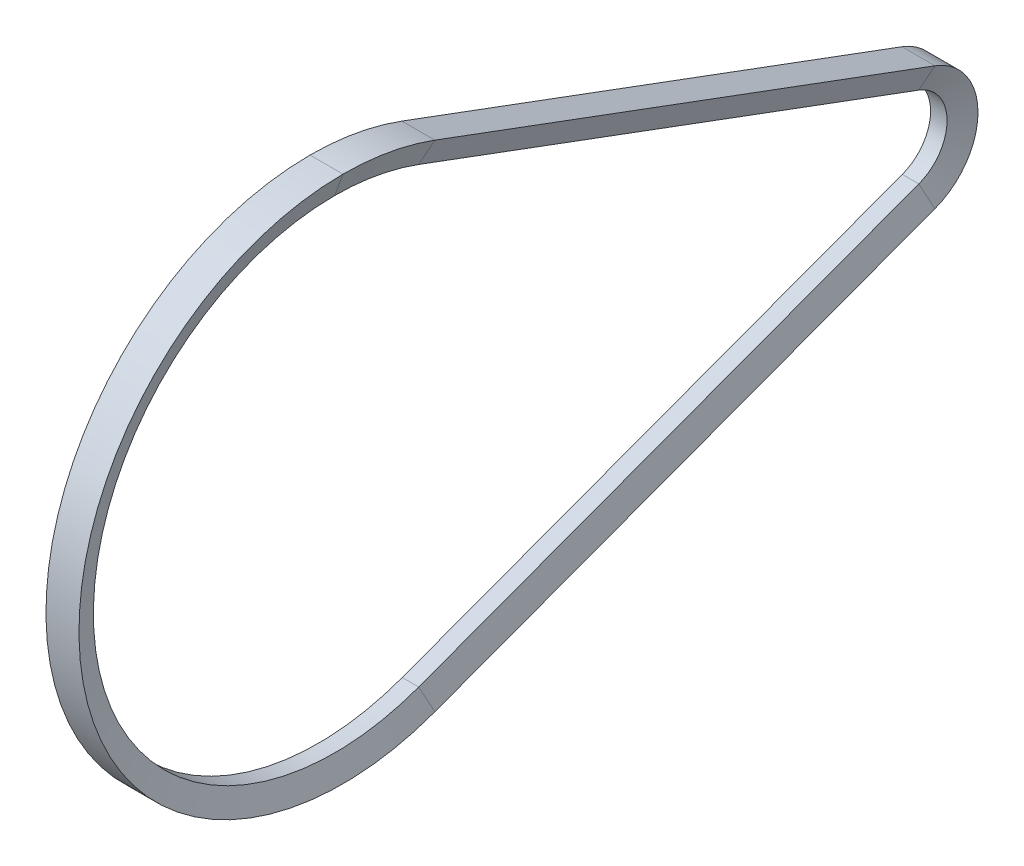
ISO-10303-21;
HEADER;
FILE_DESCRIPTION(('STEP AP214'),'2;1');
FILE_NAME('part.step','',(''),(''),'','','');
FILE_SCHEMA(('AUTOMOTIVE_DESIGN { 1 0 10303 214 1 1 1 1 }'));
ENDSEC;
DATA;
#1=APPLICATION_CONTEXT('core data for automotive mechanical design processes');
#2=APPLICATION_PROTOCOL_DEFINITION('international standard','automotive_design',2000,#1);
#3=PRODUCT_CONTEXT('',#1,'mechanical');
#4=PRODUCT('Part','Part','',(#3));
#5=PRODUCT_RELATED_PRODUCT_CATEGORY('part','',(#4));
#6=PRODUCT_DEFINITION_FORMATION('','',#4);
#7=PRODUCT_DEFINITION_CONTEXT('part definition',#1,'design');
#8=PRODUCT_DEFINITION('design','',#6,#7);
#9=PRODUCT_DEFINITION_SHAPE('','',#8);
#10=(LENGTH_UNIT() NAMED_UNIT(*) SI_UNIT(.MILLI.,.METRE.));
#11=(NAMED_UNIT(*) PLANE_ANGLE_UNIT() SI_UNIT($,.RADIAN.));
#12=(NAMED_UNIT(*) SI_UNIT($,.STERADIAN.) SOLID_ANGLE_UNIT());
#13=UNCERTAINTY_MEASURE_WITH_UNIT(LENGTH_MEASURE(1.E-05),#10,'distance_accuracy_value','');
#14=(GEOMETRIC_REPRESENTATION_CONTEXT(3) GLOBAL_UNCERTAINTY_ASSIGNED_CONTEXT((#13)) GLOBAL_UNIT_ASSIGNED_CONTEXT((#10,
#11,#12)) REPRESENTATION_CONTEXT('',''));
#15=CARTESIAN_POINT('',(0.,0.,0.));
#16=DIRECTION('',(0.,0.,1.));
#17=DIRECTION('',(1.,0.,0.));
#18=AXIS2_PLACEMENT_3D('',#15,#16,#17);
#19=CARTESIAN_POINT('',(-6.34999999999999,0.,0.));
#20=DIRECTION('',(-1.,0.,0.));
#21=DIRECTION('',(0.,0.,1.));
#22=AXIS2_PLACEMENT_3D('',#19,#20,#21);
#23=CONICAL_SURFACE('',#22,101.6,1.22173047639604);
#24=DIRECTION('',(0.342020143325663,0.880946982730876,0.32703919516911));
#25=VECTOR('',#24,1.);
#26=CARTESIAN_POINT('',(-6.34999999999994,-95.2483944915948,-35.3596287703015));
#27=LINE('',#26,#25);
#28=CARTESIAN_POINT('',(-6.34999999999994,-95.2483944915948,-35.3596287703015));
#29=VERTEX_POINT('',#28);
#30=CARTESIAN_POINT('',(-3.17208489206322,-87.0629855899733,-32.3209106728537));
#31=VERTEX_POINT('',#30);
#32=EDGE_CURVE('E164',#29,#31,#27,.T.);
#33=ORIENTED_EDGE('',*,*,#32,.F.);
#34=CARTESIAN_POINT('',(-6.34999999999999,0.,0.));
#35=DIRECTION('',(-1.,0.,0.));
#36=DIRECTION('',(0.,-0.937484197751917,-0.348027842227378));
#37=AXIS2_PLACEMENT_3D('',#34,#35,#36);
#38=CIRCLE('',#37,101.6);
#39=CARTESIAN_POINT('',(-6.34999999999994,101.6,0.));
#40=VERTEX_POINT('',#39);
#41=EDGE_CURVE('E163',#29,#40,#38,.T.);
#42=ORIENTED_EDGE('',*,*,#41,.T.);
#43=DIRECTION('',(0.342020143325663,-0.939692620785911,0.));
#44=VECTOR('',#43,1.);
#45=CARTESIAN_POINT('',(-6.34999999999994,101.6,0.));
#46=LINE('',#45,#44);
#47=CARTESIAN_POINT('',(-3.17208489206322,92.8687499999999,0.));
#48=VERTEX_POINT('',#47);
#49=EDGE_CURVE('E138',#40,#48,#46,.T.);
#50=ORIENTED_EDGE('',*,*,#49,.T.);
#51=CARTESIAN_POINT('',(-3.17208489206328,0.,0.));
#52=DIRECTION('',(-1.,0.,0.));
#53=DIRECTION('',(0.,-0.937484197751917,-0.348027842227378));
#54=AXIS2_PLACEMENT_3D('',#51,#52,#53);
#55=CIRCLE('',#54,92.86875);
#56=EDGE_CURVE('E168',#31,#48,#55,.T.);
#57=ORIENTED_EDGE('',*,*,#56,.F.);
#58=EDGE_LOOP('',(#33,#42,#50,#57));
#59=FACE_BOUND('',#58,.T.);
#60=ADVANCED_FACE('F30',(#59),#23,.F.);
#61=CARTESIAN_POINT('',(-6.34999999999999,0.,0.));
#62=DIRECTION('',(-1.,0.,0.));
#63=DIRECTION('',(0.,0.,1.));
#64=AXIS2_PLACEMENT_3D('',#61,#62,#63);
#65=CONICAL_SURFACE('',#64,101.6,1.22173047639604);
#66=CARTESIAN_POINT('',(-3.17208489206328,0.,0.));
#67=DIRECTION('',(-1.,0.,0.));
#68=DIRECTION('',(0.,1.,0.));
#69=AXIS2_PLACEMENT_3D('',#66,#67,#68);
#70=CIRCLE('',#69,92.86875);
#71=CARTESIAN_POINT('',(-3.17208489206325,87.0629855899733,-32.3209106728539));
#72=VERTEX_POINT('',#71);
#73=EDGE_CURVE('E144',#48,#72,#70,.T.);
#74=ORIENTED_EDGE('',*,*,#73,.F.);
#75=ORIENTED_EDGE('',*,*,#49,.F.);
#76=CARTESIAN_POINT('',(-6.34999999999999,0.,0.));
#77=DIRECTION('',(-1.,0.,0.));
#78=DIRECTION('',(0.,1.,0.));
#79=AXIS2_PLACEMENT_3D('',#76,#77,#78);
#80=CIRCLE('',#79,101.6);
#81=CARTESIAN_POINT('',(-6.34999999999997,95.2483944915947,-35.359628770302));
#82=VERTEX_POINT('',#81);
#83=EDGE_CURVE('E142',#40,#82,#80,.T.);
#84=ORIENTED_EDGE('',*,*,#83,.T.);
#85=DIRECTION('',(0.342020143325663,-0.880946982730875,0.327039195169111));
#86=VECTOR('',#85,1.);
#87=CARTESIAN_POINT('',(-6.34999999999997,95.2483944915947,-35.359628770302));
#88=LINE('',#87,#86);
#89=EDGE_CURVE('E160',#82,#72,#88,.T.);
#90=ORIENTED_EDGE('',*,*,#89,.T.);
#91=EDGE_LOOP('',(#74,#75,#84,#90));
#92=FACE_BOUND('',#91,.T.);
#93=ADVANCED_FACE('F140',(#92),#65,.F.);
#94=CARTESIAN_POINT('',(0.,0.,0.));
#95=DIRECTION('',(-1.,0.,0.));
#96=DIRECTION('',(0.,0.,1.));
#97=AXIS2_PLACEMENT_3D('',#94,#95,#96);
#98=CYLINDRICAL_SURFACE('',#97,92.86875);
#99=CARTESIAN_POINT('',(3.17208489206328,0.,0.));
#100=DIRECTION('',(-1.,0.,0.));
#101=DIRECTION('',(0.,1.,0.));
#102=AXIS2_PLACEMENT_3D('',#99,#100,#101);
#103=CIRCLE('',#102,92.86875);
#104=CARTESIAN_POINT('',(3.17208489206333,92.8687499999999,0.));
#105=VERTEX_POINT('',#104);
#106=CARTESIAN_POINT('',(3.17208489206333,87.0629855899733,-32.3209106728539));
#107=VERTEX_POINT('',#106);
#108=EDGE_CURVE('E209',#105,#107,#103,.T.);
#109=ORIENTED_EDGE('',*,*,#108,.F.);
#110=DIRECTION('',(1.,0.,0.));
#111=VECTOR('',#110,1.);
#112=CARTESIAN_POINT('',(3.17208489206333,92.8687499999999,0.));
#113=LINE('',#112,#111);
#114=EDGE_CURVE('E149',#48,#105,#113,.T.);
#115=ORIENTED_EDGE('',*,*,#114,.F.);
#116=ORIENTED_EDGE('',*,*,#73,.T.);
#117=DIRECTION('',(1.,0.,0.));
#118=VECTOR('',#117,1.);
#119=CARTESIAN_POINT('',(3.17208489206333,87.0629855899733,-32.3209106728539));
#120=LINE('',#119,#118);
#121=EDGE_CURVE('E230',#72,#107,#120,.T.);
#122=ORIENTED_EDGE('',*,*,#121,.T.);
#123=EDGE_LOOP('',(#109,#115,#116,#122));
#124=FACE_BOUND('',#123,.T.);
#125=ADVANCED_FACE('F256',(#124),#98,.F.);
#126=CARTESIAN_POINT('',(3.17208489206328,0.,0.));
#127=DIRECTION('',(1.,0.,0.));
#128=DIRECTION('',(0.,0.,-1.));
#129=AXIS2_PLACEMENT_3D('',#126,#127,#128);
#130=CONICAL_SURFACE('',#129,92.86875,1.22173047639604);
#131=CARTESIAN_POINT('',(6.34999999999999,0.,0.));
#132=DIRECTION('',(-1.,0.,0.));
#133=DIRECTION('',(0.,1.,0.));
#134=AXIS2_PLACEMENT_3D('',#131,#132,#133);
#135=CIRCLE('',#134,101.6);
#136=CARTESIAN_POINT('',(6.35000000000005,101.6,0.));
#137=VERTEX_POINT('',#136);
#138=CARTESIAN_POINT('',(6.35000000000005,95.2483944915947,-35.359628770302));
#139=VERTEX_POINT('',#138);
#140=EDGE_CURVE('E179',#137,#139,#135,.T.);
#141=ORIENTED_EDGE('',*,*,#140,.F.);
#142=DIRECTION('',(0.342020143325663,0.939692620785911,0.));
#143=VECTOR('',#142,1.);
#144=CARTESIAN_POINT('',(6.35000000000005,101.6,0.));
#145=LINE('',#144,#143);
#146=EDGE_CURVE('E171',#105,#137,#145,.T.);
#147=ORIENTED_EDGE('',*,*,#146,.F.);
#148=ORIENTED_EDGE('',*,*,#108,.T.);
#149=DIRECTION('',(0.342020143325663,0.880946982730875,-0.327039195169111));
#150=VECTOR('',#149,1.);
#151=CARTESIAN_POINT('',(6.35000000000005,95.2483944915947,-35.359628770302));
#152=LINE('',#151,#150);
#153=EDGE_CURVE('E206',#107,#139,#152,.T.);
#154=ORIENTED_EDGE('',*,*,#153,.T.);
#155=EDGE_LOOP('',(#141,#147,#148,#154));
#156=FACE_BOUND('',#155,.T.);
#157=ADVANCED_FACE('F253',(#156),#130,.F.);
#158=CARTESIAN_POINT('',(0.,0.,0.));
#159=DIRECTION('',(-1.,0.,0.));
#160=DIRECTION('',(0.,0.,1.));
#161=AXIS2_PLACEMENT_3D('',#158,#159,#160);
#162=CYLINDRICAL_SURFACE('',#161,101.6);
#163=DIRECTION('',(-1.,0.,0.));
#164=VECTOR('',#163,1.);
#165=CARTESIAN_POINT('',(-6.34999999999997,95.2483944915947,-35.359628770302));
#166=LINE('',#165,#164);
#167=EDGE_CURVE('E158',#139,#82,#166,.T.);
#168=ORIENTED_EDGE('',*,*,#167,.T.);
#169=ORIENTED_EDGE('',*,*,#83,.F.);
#170=DIRECTION('',(-1.,0.,0.));
#171=VECTOR('',#170,1.);
#172=CARTESIAN_POINT('',(-6.34999999999994,101.6,0.));
#173=LINE('',#172,#171);
#174=EDGE_CURVE('E156',#137,#40,#173,.T.);
#175=ORIENTED_EDGE('',*,*,#174,.F.);
#176=ORIENTED_EDGE('',*,*,#140,.T.);
#177=EDGE_LOOP('',(#168,#169,#175,#176));
#178=FACE_BOUND('',#177,.T.);
#179=ADVANCED_FACE('F154',(#178),#162,.T.);
#180=CARTESIAN_POINT('',(-6.34999999999997,95.2483944915947,-35.359628770302));
#181=DIRECTION('',(0.93969262078591,0.320638479680655,-0.119032532479929));
#182=DIRECTION('',(-0.322934428965581,0.94642134094106,0.));
#183=AXIS2_PLACEMENT_3D('',#180,#181,#182);
#184=PLANE('',#183);
#185=DIRECTION('',(0.,-0.348027842227378,-0.937484197751917));
#186=VECTOR('',#185,1.);
#187=CARTESIAN_POINT('',(-3.17208489206325,87.0629855899733,-32.3209106728539));
#188=LINE('',#187,#186);
#189=CARTESIAN_POINT('',(-3.17208489206328,15.6266897212771,-224.749189095128));
#190=VERTEX_POINT('',#189);
#191=EDGE_CURVE('E123',#72,#190,#188,.T.);
#192=ORIENTED_EDGE('',*,*,#191,.F.);
#193=ORIENTED_EDGE('',*,*,#89,.F.);
#194=DIRECTION('',(0.,-0.348027842227378,-0.937484197751917));
#195=VECTOR('',#194,1.);
#196=CARTESIAN_POINT('',(-6.34999999999997,95.2483944915947,-35.359628770302));
#197=LINE('',#196,#195);
#198=CARTESIAN_POINT('',(-6.34999999999997,23.8120986228986,-227.787907192575));
#199=VERTEX_POINT('',#198);
#200=EDGE_CURVE('E178',#82,#199,#197,.T.);
#201=ORIENTED_EDGE('',*,*,#200,.T.);
#202=DIRECTION('',(0.342020143325663,-0.880946982730875,0.327039195169111));
#203=VECTOR('',#202,1.);
#204=CARTESIAN_POINT('',(-6.34999999999997,23.8120986228986,-227.787907192575));
#205=LINE('',#204,#203);
#206=EDGE_CURVE('E250',#199,#190,#205,.T.);
#207=ORIENTED_EDGE('',*,*,#206,.T.);
#208=EDGE_LOOP('',(#192,#193,#201,#207));
#209=FACE_BOUND('',#208,.T.);
#210=ADVANCED_FACE('F260',(#209),#184,.F.);
#211=CARTESIAN_POINT('',(3.17208489206333,87.0629855899733,-32.3209106728539));
#212=DIRECTION('',(0.,0.937484197751917,-0.348027842227378));
#213=DIRECTION('',(0.,0.348027842227378,0.937484197751917));
#214=AXIS2_PLACEMENT_3D('',#211,#212,#213);
#215=PLANE('',#214);
#216=DIRECTION('',(0.,-0.348027842227378,-0.937484197751917));
#217=VECTOR('',#216,1.);
#218=CARTESIAN_POINT('',(3.17208489206333,87.0629855899733,-32.3209106728539));
#219=LINE('',#218,#217);
#220=CARTESIAN_POINT('',(3.1720848920633,15.6266897212771,-224.749189095128));
#221=VERTEX_POINT('',#220);
#222=EDGE_CURVE('E117',#107,#221,#219,.T.);
#223=ORIENTED_EDGE('',*,*,#222,.F.);
#224=ORIENTED_EDGE('',*,*,#121,.F.);
#225=ORIENTED_EDGE('',*,*,#191,.T.);
#226=DIRECTION('',(1.,0.,0.));
#227=VECTOR('',#226,1.);
#228=CARTESIAN_POINT('',(3.1720848920633,15.6266897212772,-224.749189095128));
#229=LINE('',#228,#227);
#230=EDGE_CURVE('E234',#190,#221,#229,.T.);
#231=ORIENTED_EDGE('',*,*,#230,.T.);
#232=EDGE_LOOP('',(#223,#224,#225,#231));
#233=FACE_BOUND('',#232,.T.);
#234=ADVANCED_FACE('F251',(#233),#215,.F.);
#235=CARTESIAN_POINT('',(6.35000000000005,95.2483944915947,-35.359628770302));
#236=DIRECTION('',(-0.939692620785911,0.320638479680655,-0.119032532479929));
#237=DIRECTION('',(-0.322934428965581,-0.94642134094106,0.));
#238=AXIS2_PLACEMENT_3D('',#235,#236,#237);
#239=PLANE('',#238);
#240=DIRECTION('',(0.,-0.348027842227378,-0.937484197751917));
#241=VECTOR('',#240,1.);
#242=CARTESIAN_POINT('',(6.35000000000005,95.2483944915947,-35.359628770302));
#243=LINE('',#242,#241);
#244=CARTESIAN_POINT('',(6.35000000000002,23.8120986228986,-227.787907192575));
#245=VERTEX_POINT('',#244);
#246=EDGE_CURVE('E183',#139,#245,#243,.T.);
#247=ORIENTED_EDGE('',*,*,#246,.F.);
#248=ORIENTED_EDGE('',*,*,#153,.F.);
#249=ORIENTED_EDGE('',*,*,#222,.T.);
#250=DIRECTION('',(0.342020143325663,0.880946982730875,-0.327039195169111));
#251=VECTOR('',#250,1.);
#252=CARTESIAN_POINT('',(6.35000000000002,23.8120986228986,-227.787907192575));
#253=LINE('',#252,#251);
#254=EDGE_CURVE('E211',#221,#245,#253,.T.);
#255=ORIENTED_EDGE('',*,*,#254,.T.);
#256=EDGE_LOOP('',(#247,#248,#249,#255));
#257=FACE_BOUND('',#256,.T.);
#258=ADVANCED_FACE('F215',(#257),#239,.F.);
#259=CARTESIAN_POINT('',(-6.34999999999997,95.2483944915947,-35.359628770302));
#260=DIRECTION('',(0.,-0.937484197751917,0.348027842227378));
#261=DIRECTION('',(0.,-0.348027842227378,-0.937484197751917));
#262=AXIS2_PLACEMENT_3D('',#259,#260,#261);
#263=PLANE('',#262);
#264=DIRECTION('',(-1.,0.,0.));
#265=VECTOR('',#264,1.);
#266=CARTESIAN_POINT('',(-6.34999999999997,23.8120986228986,-227.787907192575));
#267=LINE('',#266,#265);
#268=EDGE_CURVE('E180',#245,#199,#267,.T.);
#269=ORIENTED_EDGE('',*,*,#268,.T.);
#270=ORIENTED_EDGE('',*,*,#200,.F.);
#271=ORIENTED_EDGE('',*,*,#167,.F.);
#272=ORIENTED_EDGE('',*,*,#246,.T.);
#273=EDGE_LOOP('',(#269,#270,#271,#272));
#274=FACE_BOUND('',#273,.T.);
#275=ADVANCED_FACE('F214',(#274),#263,.F.);
#276=CARTESIAN_POINT('',(-6.34999999999999,-1.11022302462516E-13,-218.948));
#277=DIRECTION('',(-1.,0.,0.));
#278=DIRECTION('',(0.,0.,1.));
#279=AXIS2_PLACEMENT_3D('',#276,#277,#278);
#280=CONICAL_SURFACE('',#279,25.3999999999999,1.22173047639604);
#281=CARTESIAN_POINT('',(-3.17208489206328,-1.11022302462516E-13,-218.948));
#282=DIRECTION('',(-1.,0.,0.));
#283=DIRECTION('',(0.,0.937484197751916,-0.348027842227381));
#284=AXIS2_PLACEMENT_3D('',#281,#282,#283);
#285=CIRCLE('',#284,16.66875);
#286=CARTESIAN_POINT('',(-3.17208489206328,-15.6266897212772,-224.749189095128));
#287=VERTEX_POINT('',#286);
#288=EDGE_CURVE('E100',#190,#287,#285,.T.);
#289=ORIENTED_EDGE('',*,*,#288,.F.);
#290=ORIENTED_EDGE('',*,*,#206,.F.);
#291=CARTESIAN_POINT('',(-6.34999999999999,-1.11022302462516E-13,-218.948));
#292=DIRECTION('',(-1.,0.,0.));
#293=DIRECTION('',(0.,0.937484197751916,-0.34802784222738));
#294=AXIS2_PLACEMENT_3D('',#291,#292,#293);
#295=CIRCLE('',#294,25.3999999999999);
#296=CARTESIAN_POINT('',(-6.34999999999999,-23.8120986228987,-227.787907192575));
#297=VERTEX_POINT('',#296);
#298=EDGE_CURVE('E182',#199,#297,#295,.T.);
#299=ORIENTED_EDGE('',*,*,#298,.T.);
#300=DIRECTION('',(0.342020143325663,0.880946982730876,0.327039195169111));
#301=VECTOR('',#300,1.);
#302=CARTESIAN_POINT('',(-6.34999999999999,-23.8120986228987,-227.787907192575));
#303=LINE('',#302,#301);
#304=EDGE_CURVE('E221',#297,#287,#303,.T.);
#305=ORIENTED_EDGE('',*,*,#304,.T.);
#306=EDGE_LOOP('',(#289,#290,#299,#305));
#307=FACE_BOUND('',#306,.T.);
#308=ADVANCED_FACE('F249',(#307),#280,.F.);
#309=CARTESIAN_POINT('',(0.,-1.11022302462516E-13,-218.948));
#310=DIRECTION('',(-1.,0.,0.));
#311=DIRECTION('',(0.,0.,1.));
#312=AXIS2_PLACEMENT_3D('',#309,#310,#311);
#313=CYLINDRICAL_SURFACE('',#312,16.66875);
#314=CARTESIAN_POINT('',(3.1720848920633,-1.11022302462516E-13,-218.948));
#315=DIRECTION('',(-1.,0.,0.));
#316=DIRECTION('',(0.,0.937484197751916,-0.348027842227381));
#317=AXIS2_PLACEMENT_3D('',#314,#315,#316);
#318=CIRCLE('',#317,16.66875);
#319=CARTESIAN_POINT('',(3.17208489206328,-15.6266897212772,-224.749189095128));
#320=VERTEX_POINT('',#319);
#321=EDGE_CURVE('E93',#221,#320,#318,.T.);
#322=ORIENTED_EDGE('',*,*,#321,.F.);
#323=ORIENTED_EDGE('',*,*,#230,.F.);
#324=ORIENTED_EDGE('',*,*,#288,.T.);
#325=DIRECTION('',(1.,0.,0.));
#326=VECTOR('',#325,1.);
#327=CARTESIAN_POINT('',(3.17208489206328,-15.6266897212772,-224.749189095128));
#328=LINE('',#327,#326);
#329=EDGE_CURVE('E237',#287,#320,#328,.T.);
#330=ORIENTED_EDGE('',*,*,#329,.T.);
#331=EDGE_LOOP('',(#322,#323,#324,#330));
#332=FACE_BOUND('',#331,.T.);
#333=ADVANCED_FACE('F239',(#332),#313,.F.);
#334=CARTESIAN_POINT('',(3.1720848920633,-1.11022302462516E-13,-218.948));
#335=DIRECTION('',(1.,0.,0.));
#336=DIRECTION('',(0.,0.,-1.));
#337=AXIS2_PLACEMENT_3D('',#334,#335,#336);
#338=CONICAL_SURFACE('',#337,16.66875,1.22173047639604);
#339=CARTESIAN_POINT('',(6.35000000000002,-1.11022302462516E-13,-218.948));
#340=DIRECTION('',(-1.,0.,0.));
#341=DIRECTION('',(0.,0.937484197751916,-0.34802784222738));
#342=AXIS2_PLACEMENT_3D('',#339,#340,#341);
#343=CIRCLE('',#342,25.3999999999999);
#344=CARTESIAN_POINT('',(6.34999999999999,-23.8120986228987,-227.787907192575));
#345=VERTEX_POINT('',#344);
#346=EDGE_CURVE('E84',#245,#345,#343,.T.);
#347=ORIENTED_EDGE('',*,*,#346,.F.);
#348=ORIENTED_EDGE('',*,*,#254,.F.);
#349=ORIENTED_EDGE('',*,*,#321,.T.);
#350=DIRECTION('',(0.342020143325663,-0.880946982730876,-0.327039195169111));
#351=VECTOR('',#350,1.);
#352=CARTESIAN_POINT('',(6.34999999999999,-23.8120986228987,-227.787907192575));
#353=LINE('',#352,#351);
#354=EDGE_CURVE('E190',#320,#345,#353,.T.);
#355=ORIENTED_EDGE('',*,*,#354,.T.);
#356=EDGE_LOOP('',(#347,#348,#349,#355));
#357=FACE_BOUND('',#356,.T.);
#358=ADVANCED_FACE('F216',(#357),#338,.F.);
#359=CARTESIAN_POINT('',(0.,-1.11022302462516E-13,-218.948));
#360=DIRECTION('',(-1.,0.,0.));
#361=DIRECTION('',(0.,0.,1.));
#362=AXIS2_PLACEMENT_3D('',#359,#360,#361);
#363=CYLINDRICAL_SURFACE('',#362,25.3999999999999);
#364=DIRECTION('',(-1.,0.,0.));
#365=VECTOR('',#364,1.);
#366=CARTESIAN_POINT('',(-6.34999999999999,-23.8120986228987,-227.787907192575));
#367=LINE('',#366,#365);
#368=EDGE_CURVE('E184',#345,#297,#367,.T.);
#369=ORIENTED_EDGE('',*,*,#368,.T.);
#370=ORIENTED_EDGE('',*,*,#298,.F.);
#371=ORIENTED_EDGE('',*,*,#268,.F.);
#372=ORIENTED_EDGE('',*,*,#346,.T.);
#373=EDGE_LOOP('',(#369,#370,#371,#372));
#374=FACE_BOUND('',#373,.T.);
#375=ADVANCED_FACE('F217',(#374),#363,.T.);
#376=CARTESIAN_POINT('',(-6.34999999999999,-23.8120986228987,-227.787907192575));
#377=DIRECTION('',(0.93969262078591,-0.320638479680655,-0.119032532479929));
#378=DIRECTION('',(0.322934428965581,0.94642134094106,0.));
#379=AXIS2_PLACEMENT_3D('',#376,#377,#378);
#380=PLANE('',#379);
#381=DIRECTION('',(0.,-0.348027842227378,0.937484197751917));
#382=VECTOR('',#381,1.);
#383=CARTESIAN_POINT('',(-3.17208489206328,-15.6266897212772,-224.749189095128));
#384=LINE('',#383,#382);
#385=EDGE_CURVE('E188',#287,#31,#384,.T.);
#386=ORIENTED_EDGE('',*,*,#385,.F.);
#387=ORIENTED_EDGE('',*,*,#304,.F.);
#388=DIRECTION('',(0.,-0.348027842227378,0.937484197751917));
#389=VECTOR('',#388,1.);
#390=CARTESIAN_POINT('',(-6.34999999999999,-23.8120986228987,-227.787907192575));
#391=LINE('',#390,#389);
#392=EDGE_CURVE('E185',#297,#29,#391,.T.);
#393=ORIENTED_EDGE('',*,*,#392,.T.);
#394=ORIENTED_EDGE('',*,*,#32,.T.);
#395=EDGE_LOOP('',(#386,#387,#393,#394));
#396=FACE_BOUND('',#395,.T.);
#397=ADVANCED_FACE('F248',(#396),#380,.F.);
#398=CARTESIAN_POINT('',(3.17208489206328,-15.6266897212772,-224.749189095128));
#399=DIRECTION('',(0.,-0.937484197751917,-0.348027842227378));
#400=DIRECTION('',(0.,0.348027842227378,-0.937484197751917));
#401=AXIS2_PLACEMENT_3D('',#398,#399,#400);
#402=PLANE('',#401);
#403=DIRECTION('',(0.,-0.348027842227378,0.937484197751917));
#404=VECTOR('',#403,1.);
#405=CARTESIAN_POINT('',(3.17208489206328,-15.6266897212772,-224.749189095128));
#406=LINE('',#405,#404);
#407=CARTESIAN_POINT('',(3.17208489206333,-87.0629855899733,-32.3209106728537));
#408=VERTEX_POINT('',#407);
#409=EDGE_CURVE('E55',#320,#408,#406,.T.);
#410=ORIENTED_EDGE('',*,*,#409,.F.);
#411=ORIENTED_EDGE('',*,*,#329,.F.);
#412=ORIENTED_EDGE('',*,*,#385,.T.);
#413=DIRECTION('',(1.,0.,0.));
#414=VECTOR('',#413,1.);
#415=CARTESIAN_POINT('',(3.17208489206333,-87.0629855899733,-32.3209106728537));
#416=LINE('',#415,#414);
#417=EDGE_CURVE('E196',#31,#408,#416,.T.);
#418=ORIENTED_EDGE('',*,*,#417,.T.);
#419=EDGE_LOOP('',(#410,#411,#412,#418));
#420=FACE_BOUND('',#419,.T.);
#421=ADVANCED_FACE('F241',(#420),#402,.F.);
#422=CARTESIAN_POINT('',(6.34999999999999,-23.8120986228987,-227.787907192575));
#423=DIRECTION('',(-0.939692620785911,-0.320638479680655,-0.119032532479929));
#424=DIRECTION('',(0.322934428965581,-0.94642134094106,0.));
#425=AXIS2_PLACEMENT_3D('',#422,#423,#424);
#426=PLANE('',#425);
#427=DIRECTION('',(0.,-0.348027842227378,0.937484197751917));
#428=VECTOR('',#427,1.);
#429=CARTESIAN_POINT('',(6.34999999999999,-23.8120986228987,-227.787907192575));
#430=LINE('',#429,#428);
#431=CARTESIAN_POINT('',(6.35000000000005,-95.2483944915948,-35.3596287703015));
#432=VERTEX_POINT('',#431);
#433=EDGE_CURVE('E47',#345,#432,#430,.T.);
#434=ORIENTED_EDGE('',*,*,#433,.F.);
#435=ORIENTED_EDGE('',*,*,#354,.F.);
#436=ORIENTED_EDGE('',*,*,#409,.T.);
#437=DIRECTION('',(0.342020143325663,-0.880946982730876,-0.32703919516911));
#438=VECTOR('',#437,1.);
#439=CARTESIAN_POINT('',(6.35000000000005,-95.2483944915948,-35.3596287703015));
#440=LINE('',#439,#438);
#441=EDGE_CURVE('E195',#408,#432,#440,.T.);
#442=ORIENTED_EDGE('',*,*,#441,.T.);
#443=EDGE_LOOP('',(#434,#435,#436,#442));
#444=FACE_BOUND('',#443,.T.);
#445=ADVANCED_FACE('F244',(#444),#426,.F.);
#446=CARTESIAN_POINT('',(-6.34999999999999,-23.8120986228987,-227.787907192575));
#447=DIRECTION('',(0.,0.937484197751917,0.348027842227378));
#448=DIRECTION('',(0.,-0.348027842227378,0.937484197751917));
#449=AXIS2_PLACEMENT_3D('',#446,#447,#448);
#450=PLANE('',#449);
#451=DIRECTION('',(-1.,0.,0.));
#452=VECTOR('',#451,1.);
#453=CARTESIAN_POINT('',(-6.34999999999994,-95.2483944915948,-35.3596287703015));
#454=LINE('',#453,#452);
#455=EDGE_CURVE('E34',#432,#29,#454,.T.);
#456=ORIENTED_EDGE('',*,*,#455,.T.);
#457=ORIENTED_EDGE('',*,*,#392,.F.);
#458=ORIENTED_EDGE('',*,*,#368,.F.);
#459=ORIENTED_EDGE('',*,*,#433,.T.);
#460=EDGE_LOOP('',(#456,#457,#458,#459));
#461=FACE_BOUND('',#460,.T.);
#462=ADVANCED_FACE('F245',(#461),#450,.F.);
#463=CARTESIAN_POINT('',(0.,0.,0.));
#464=DIRECTION('',(-1.,0.,0.));
#465=DIRECTION('',(0.,0.,1.));
#466=AXIS2_PLACEMENT_3D('',#463,#464,#465);
#467=CYLINDRICAL_SURFACE('',#466,92.86875);
#468=ORIENTED_EDGE('',*,*,#56,.T.);
#469=ORIENTED_EDGE('',*,*,#114,.T.);
#470=CARTESIAN_POINT('',(3.17208489206328,0.,0.));
#471=DIRECTION('',(-1.,0.,0.));
#472=DIRECTION('',(0.,-0.937484197751917,-0.348027842227378));
#473=AXIS2_PLACEMENT_3D('',#470,#471,#472);
#474=CIRCLE('',#473,92.86875);
#475=EDGE_CURVE('E39',#408,#105,#474,.T.);
#476=ORIENTED_EDGE('',*,*,#475,.F.);
#477=ORIENTED_EDGE('',*,*,#417,.F.);
#478=EDGE_LOOP('',(#468,#469,#476,#477));
#479=FACE_BOUND('',#478,.T.);
#480=ADVANCED_FACE('F287',(#479),#467,.F.);
#481=CARTESIAN_POINT('',(3.17208489206328,0.,0.));
#482=DIRECTION('',(1.,0.,0.));
#483=DIRECTION('',(0.,0.,-1.));
#484=AXIS2_PLACEMENT_3D('',#481,#482,#483);
#485=CONICAL_SURFACE('',#484,92.86875,1.22173047639604);
#486=ORIENTED_EDGE('',*,*,#475,.T.);
#487=ORIENTED_EDGE('',*,*,#146,.T.);
#488=CARTESIAN_POINT('',(6.34999999999999,0.,0.));
#489=DIRECTION('',(-1.,0.,0.));
#490=DIRECTION('',(0.,-0.937484197751917,-0.348027842227378));
#491=AXIS2_PLACEMENT_3D('',#488,#489,#490);
#492=CIRCLE('',#491,101.6);
#493=EDGE_CURVE('E11',#432,#137,#492,.T.);
#494=ORIENTED_EDGE('',*,*,#493,.F.);
#495=ORIENTED_EDGE('',*,*,#441,.F.);
#496=EDGE_LOOP('',(#486,#487,#494,#495));
#497=FACE_BOUND('',#496,.T.);
#498=ADVANCED_FACE('F290',(#497),#485,.F.);
#499=CARTESIAN_POINT('',(0.,0.,0.));
#500=DIRECTION('',(-1.,0.,0.));
#501=DIRECTION('',(0.,0.,1.));
#502=AXIS2_PLACEMENT_3D('',#499,#500,#501);
#503=CYLINDRICAL_SURFACE('',#502,101.6);
#504=ORIENTED_EDGE('',*,*,#493,.T.);
#505=ORIENTED_EDGE('',*,*,#174,.T.);
#506=ORIENTED_EDGE('',*,*,#41,.F.);
#507=ORIENTED_EDGE('',*,*,#455,.F.);
#508=EDGE_LOOP('',(#504,#505,#506,#507));
#509=FACE_BOUND('',#508,.T.);
#510=ADVANCED_FACE('F32',(#509),#503,.T.);
#511=CLOSED_SHELL('',(#60,#93,#125,#157,#179,#210,#234,#258,#275,#308,#333,#358,#375,#397,#421,
#445,#462,#480,#498,#510));
#512=MANIFOLD_SOLID_BREP('B2',#511);
#513=ADVANCED_BREP_SHAPE_REPRESENTATION('',(#18,#512),#14);
#514=SHAPE_DEFINITION_REPRESENTATION(#9,#513);
ENDSEC;
END-ISO-10303-21;
